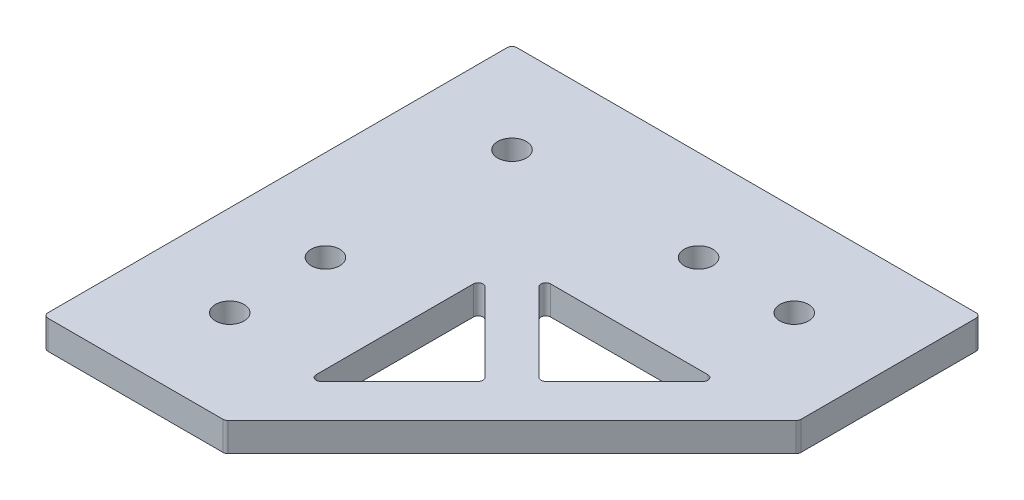
ISO-10303-21;
HEADER;
FILE_DESCRIPTION(('STEP AP214'),'2;1');
FILE_NAME('part.step','',(''),(''),'','','');
FILE_SCHEMA(('AUTOMOTIVE_DESIGN { 1 0 10303 214 1 1 1 1 }'));
ENDSEC;
DATA;
#1=APPLICATION_CONTEXT('core data for automotive mechanical design processes');
#2=APPLICATION_PROTOCOL_DEFINITION('international standard','automotive_design',2000,#1);
#3=PRODUCT_CONTEXT('',#1,'mechanical');
#4=PRODUCT('Part','Part','',(#3));
#5=PRODUCT_RELATED_PRODUCT_CATEGORY('part','',(#4));
#6=PRODUCT_DEFINITION_FORMATION('','',#4);
#7=PRODUCT_DEFINITION_CONTEXT('part definition',#1,'design');
#8=PRODUCT_DEFINITION('design','',#6,#7);
#9=PRODUCT_DEFINITION_SHAPE('','',#8);
#10=(LENGTH_UNIT() NAMED_UNIT(*) SI_UNIT(.MILLI.,.METRE.));
#11=(NAMED_UNIT(*) PLANE_ANGLE_UNIT() SI_UNIT($,.RADIAN.));
#12=(NAMED_UNIT(*) SI_UNIT($,.STERADIAN.) SOLID_ANGLE_UNIT());
#13=UNCERTAINTY_MEASURE_WITH_UNIT(LENGTH_MEASURE(1.E-05),#10,'distance_accuracy_value','');
#14=(GEOMETRIC_REPRESENTATION_CONTEXT(3) GLOBAL_UNCERTAINTY_ASSIGNED_CONTEXT((#13)) GLOBAL_UNIT_ASSIGNED_CONTEXT((#10,
#11,#12)) REPRESENTATION_CONTEXT('',''));
#15=CARTESIAN_POINT('',(0.,0.,0.));
#16=DIRECTION('',(0.,0.,1.));
#17=DIRECTION('',(1.,0.,0.));
#18=AXIS2_PLACEMENT_3D('',#15,#16,#17);
#19=CARTESIAN_POINT('',(0.,3.,0.));
#20=DIRECTION('',(0.,1.,0.));
#21=DIRECTION('',(0.,0.,1.));
#22=AXIS2_PLACEMENT_3D('',#19,#20,#21);
#23=PLANE('',#22);
#24=CARTESIAN_POINT('',(28.3431457505076,3.,31.8786796564404));
#25=DIRECTION('',(0.,1.,0.));
#26=DIRECTION('',(0.,0.,-1.));
#27=AXIS2_PLACEMENT_3D('',#24,#25,#26);
#28=CIRCLE('',#27,0.499999999999998);
#29=CARTESIAN_POINT('',(28.6966991411009,3.,32.2322330470336));
#30=VERTEX_POINT('',#29);
#31=CARTESIAN_POINT('',(28.6966991411009,3.,31.5251262658471));
#32=VERTEX_POINT('',#31);
#33=EDGE_CURVE('E48',#30,#32,#28,.T.);
#34=ORIENTED_EDGE('',*,*,#33,.F.);
#35=DIRECTION('',(0.707106781186547,0.,-0.707106781186548));
#36=VECTOR('',#35,1.);
#37=CARTESIAN_POINT('',(28.6966991411009,3.,32.2322330470336));
#38=LINE('',#37,#36);
#39=CARTESIAN_POINT('',(20.4764466094067,3.,40.4524855787278));
#40=VERTEX_POINT('',#39);
#41=EDGE_CURVE('E204',#40,#30,#38,.T.);
#42=ORIENTED_EDGE('',*,*,#41,.F.);
#43=CARTESIAN_POINT('',(20.1228932188135,3.,40.0989321881345));
#44=DIRECTION('',(0.,1.,0.));
#45=DIRECTION('',(0.,0.,-1.));
#46=AXIS2_PLACEMENT_3D('',#43,#44,#45);
#47=CIRCLE('',#46,0.500000000000001);
#48=CARTESIAN_POINT('',(19.6228932188135,3.,40.0989321881345));
#49=VERTEX_POINT('',#48);
#50=EDGE_CURVE('E207',#49,#40,#47,.T.);
#51=ORIENTED_EDGE('',*,*,#50,.F.);
#52=DIRECTION('',(0.,0.,1.));
#53=VECTOR('',#52,1.);
#54=CARTESIAN_POINT('',(19.6228932188135,3.,40.0989321881345));
#55=LINE('',#54,#53);
#56=CARTESIAN_POINT('',(19.6228932188135,3.,23.6584271247462));
#57=VERTEX_POINT('',#56);
#58=EDGE_CURVE('E223',#57,#49,#55,.T.);
#59=ORIENTED_EDGE('',*,*,#58,.F.);
#60=CARTESIAN_POINT('',(20.1228932188135,3.,23.6584271247462));
#61=DIRECTION('',(0.,1.,0.));
#62=DIRECTION('',(0.,0.,1.));
#63=AXIS2_PLACEMENT_3D('',#60,#61,#62);
#64=CIRCLE('',#63,0.499999999999999);
#65=CARTESIAN_POINT('',(20.4764466094067,3.,23.3048737341529));
#66=VERTEX_POINT('',#65);
#67=EDGE_CURVE('E220',#66,#57,#64,.T.);
#68=ORIENTED_EDGE('',*,*,#67,.F.);
#69=DIRECTION('',(-0.707106781186548,0.,-0.707106781186548));
#70=VECTOR('',#69,1.);
#71=CARTESIAN_POINT('',(20.4764466094067,3.,23.3048737341529));
#72=LINE('',#71,#70);
#73=EDGE_CURVE('E218',#32,#66,#72,.T.);
#74=ORIENTED_EDGE('',*,*,#73,.F.);
#75=EDGE_LOOP('',(#34,#42,#51,#59,#68,#74));
#76=FACE_BOUND('',#75,.T.);
#77=CARTESIAN_POINT('',(40.0989321881345,3.,20.1228932188135));
#78=DIRECTION('',(0.,1.,0.));
#79=DIRECTION('',(0.,0.,-1.));
#80=AXIS2_PLACEMENT_3D('',#77,#78,#79);
#81=CIRCLE('',#80,0.500000000000001);
#82=CARTESIAN_POINT('',(40.4524855787278,3.,20.4764466094067));
#83=VERTEX_POINT('',#82);
#84=CARTESIAN_POINT('',(40.0989321881345,3.,19.6228932188135));
#85=VERTEX_POINT('',#84);
#86=EDGE_CURVE('E56',#83,#85,#81,.T.);
#87=ORIENTED_EDGE('',*,*,#86,.F.);
#88=DIRECTION('',(0.707106781186548,0.,-0.707106781186547));
#89=VECTOR('',#88,1.);
#90=CARTESIAN_POINT('',(40.4524855787278,3.,20.4764466094067));
#91=LINE('',#90,#89);
#92=CARTESIAN_POINT('',(32.2322330470336,3.,28.6966991411009));
#93=VERTEX_POINT('',#92);
#94=EDGE_CURVE('E241',#93,#83,#91,.T.);
#95=ORIENTED_EDGE('',*,*,#94,.F.);
#96=CARTESIAN_POINT('',(31.8786796564404,3.,28.3431457505076));
#97=DIRECTION('',(0.,1.,0.));
#98=DIRECTION('',(0.,0.,-1.));
#99=AXIS2_PLACEMENT_3D('',#96,#97,#98);
#100=CIRCLE('',#99,0.500000000000003);
#101=CARTESIAN_POINT('',(31.5251262658471,3.,28.6966991411009));
#102=VERTEX_POINT('',#101);
#103=EDGE_CURVE('E267',#102,#93,#100,.T.);
#104=ORIENTED_EDGE('',*,*,#103,.F.);
#105=DIRECTION('',(0.707106781186547,0.,0.707106781186548));
#106=VECTOR('',#105,1.);
#107=CARTESIAN_POINT('',(31.5251262658471,3.,28.6966991411009));
#108=LINE('',#107,#106);
#109=CARTESIAN_POINT('',(23.3048737341529,3.,20.4764466094067));
#110=VERTEX_POINT('',#109);
#111=EDGE_CURVE('E264',#110,#102,#108,.T.);
#112=ORIENTED_EDGE('',*,*,#111,.F.);
#113=CARTESIAN_POINT('',(23.6584271247462,3.,20.1228932188135));
#114=DIRECTION('',(0.,1.,0.));
#115=DIRECTION('',(0.,0.,1.));
#116=AXIS2_PLACEMENT_3D('',#113,#114,#115);
#117=CIRCLE('',#116,0.499999999999999);
#118=CARTESIAN_POINT('',(23.6584271247462,3.,19.6228932188135));
#119=VERTEX_POINT('',#118);
#120=EDGE_CURVE('E261',#119,#110,#117,.T.);
#121=ORIENTED_EDGE('',*,*,#120,.F.);
#122=DIRECTION('',(-1.,0.,0.));
#123=VECTOR('',#122,1.);
#124=CARTESIAN_POINT('',(23.6584271247462,3.,19.6228932188135));
#125=LINE('',#124,#123);
#126=EDGE_CURVE('E258',#85,#119,#125,.T.);
#127=ORIENTED_EDGE('',*,*,#126,.F.);
#128=EDGE_LOOP('',(#87,#95,#104,#112,#121,#127));
#129=FACE_BOUND('',#128,.T.);
#130=CARTESIAN_POINT('',(9.50000000000001,3.,29.));
#131=DIRECTION('',(0.,1.,0.));
#132=DIRECTION('',(0.,0.,1.));
#133=AXIS2_PLACEMENT_3D('',#130,#131,#132);
#134=CIRCLE('',#133,1.5);
#135=CARTESIAN_POINT('',(9.50000000000001,3.,30.5));
#136=VERTEX_POINT('',#135);
#137=EDGE_CURVE('E290',#136,#136,#134,.T.);
#138=ORIENTED_EDGE('',*,*,#137,.F.);
#139=EDGE_LOOP('',(#138));
#140=FACE_BOUND('',#139,.T.);
#141=CARTESIAN_POINT('',(39.,3.,9.5));
#142=DIRECTION('',(0.,1.,0.));
#143=DIRECTION('',(0.,0.,1.));
#144=AXIS2_PLACEMENT_3D('',#141,#142,#143);
#145=CIRCLE('',#144,1.5);
#146=CARTESIAN_POINT('',(39.,3.,11.));
#147=VERTEX_POINT('',#146);
#148=EDGE_CURVE('E302',#147,#147,#145,.T.);
#149=ORIENTED_EDGE('',*,*,#148,.F.);
#150=EDGE_LOOP('',(#149));
#151=FACE_BOUND('',#150,.T.);
#152=DIRECTION('',(-1.,0.,0.));
#153=VECTOR('',#152,1.);
#154=CARTESIAN_POINT('',(0.,3.,0.));
#155=LINE('',#154,#153);
#156=CARTESIAN_POINT('',(48.5,3.,0.));
#157=VERTEX_POINT('',#156);
#158=CARTESIAN_POINT('',(0.499999999999996,3.,0.));
#159=VERTEX_POINT('',#158);
#160=EDGE_CURVE('E327',#157,#159,#155,.T.);
#161=ORIENTED_EDGE('',*,*,#160,.T.);
#162=CARTESIAN_POINT('',(0.499999999999996,3.,0.5));
#163=DIRECTION('',(0.,1.,0.));
#164=DIRECTION('',(0.,0.,1.));
#165=AXIS2_PLACEMENT_3D('',#162,#163,#164);
#166=CIRCLE('',#165,0.5);
#167=CARTESIAN_POINT('',(0.,3.,0.500000000000001));
#168=VERTEX_POINT('',#167);
#169=EDGE_CURVE('E371',#159,#168,#166,.T.);
#170=ORIENTED_EDGE('',*,*,#169,.T.);
#171=DIRECTION('',(0.,0.,1.));
#172=VECTOR('',#171,1.);
#173=CARTESIAN_POINT('',(0.,3.,0.));
#174=LINE('',#173,#172);
#175=CARTESIAN_POINT('',(0.,3.,48.5));
#176=VERTEX_POINT('',#175);
#177=EDGE_CURVE('E314',#168,#176,#174,.T.);
#178=ORIENTED_EDGE('',*,*,#177,.T.);
#179=CARTESIAN_POINT('',(0.500000000000006,3.,48.5));
#180=DIRECTION('',(0.,1.,0.));
#181=DIRECTION('',(0.,0.,1.));
#182=AXIS2_PLACEMENT_3D('',#179,#180,#181);
#183=CIRCLE('',#182,0.5);
#184=CARTESIAN_POINT('',(0.500000000000006,3.,49.));
#185=VERTEX_POINT('',#184);
#186=EDGE_CURVE('E365',#176,#185,#183,.T.);
#187=ORIENTED_EDGE('',*,*,#186,.T.);
#188=DIRECTION('',(1.,0.,0.));
#189=VECTOR('',#188,1.);
#190=CARTESIAN_POINT('',(0.,3.,49.));
#191=LINE('',#190,#189);
#192=CARTESIAN_POINT('',(18.7928932188135,3.,49.));
#193=VERTEX_POINT('',#192);
#194=EDGE_CURVE('E317',#185,#193,#191,.T.);
#195=ORIENTED_EDGE('',*,*,#194,.T.);
#196=CARTESIAN_POINT('',(18.7928932188135,3.,48.5));
#197=DIRECTION('',(0.,1.,0.));
#198=DIRECTION('',(0.,0.,1.));
#199=AXIS2_PLACEMENT_3D('',#196,#197,#198);
#200=CIRCLE('',#199,0.5);
#201=CARTESIAN_POINT('',(19.1464466094067,3.,48.8535533905933));
#202=VERTEX_POINT('',#201);
#203=EDGE_CURVE('E363',#193,#202,#200,.T.);
#204=ORIENTED_EDGE('',*,*,#203,.T.);
#205=DIRECTION('',(0.707106781186547,0.,-0.707106781186547));
#206=VECTOR('',#205,1.);
#207=CARTESIAN_POINT('',(49.,3.,19.));
#208=LINE('',#207,#206);
#209=CARTESIAN_POINT('',(48.8535533905933,3.,19.1464466094067));
#210=VERTEX_POINT('',#209);
#211=EDGE_CURVE('E321',#202,#210,#208,.T.);
#212=ORIENTED_EDGE('',*,*,#211,.T.);
#213=CARTESIAN_POINT('',(48.5,3.,18.7928932188135));
#214=DIRECTION('',(0.,1.,0.));
#215=DIRECTION('',(0.,0.,1.));
#216=AXIS2_PLACEMENT_3D('',#213,#214,#215);
#217=CIRCLE('',#216,0.5);
#218=CARTESIAN_POINT('',(49.,3.,18.7928932188135));
#219=VERTEX_POINT('',#218);
#220=EDGE_CURVE('E367',#210,#219,#217,.T.);
#221=ORIENTED_EDGE('',*,*,#220,.T.);
#222=DIRECTION('',(0.,0.,-1.));
#223=VECTOR('',#222,1.);
#224=CARTESIAN_POINT('',(49.,3.,0.));
#225=LINE('',#224,#223);
#226=CARTESIAN_POINT('',(49.,3.,0.5));
#227=VERTEX_POINT('',#226);
#228=EDGE_CURVE('E324',#219,#227,#225,.T.);
#229=ORIENTED_EDGE('',*,*,#228,.T.);
#230=CARTESIAN_POINT('',(48.5,3.,0.5));
#231=DIRECTION('',(0.,1.,0.));
#232=DIRECTION('',(0.,0.,1.));
#233=AXIS2_PLACEMENT_3D('',#230,#231,#232);
#234=CIRCLE('',#233,0.5);
#235=EDGE_CURVE('E369',#227,#157,#234,.T.);
#236=ORIENTED_EDGE('',*,*,#235,.T.);
#237=EDGE_LOOP('',(#161,#170,#178,#187,#195,#204,#212,#221,#229,#236));
#238=FACE_BOUND('',#237,.T.);
#239=CARTESIAN_POINT('',(9.50000000000001,3.,9.5));
#240=DIRECTION('',(0.,1.,0.));
#241=DIRECTION('',(0.,0.,1.));
#242=AXIS2_PLACEMENT_3D('',#239,#240,#241);
#243=CIRCLE('',#242,1.5);
#244=CARTESIAN_POINT('',(9.50000000000001,3.,11.));
#245=VERTEX_POINT('',#244);
#246=EDGE_CURVE('E308',#245,#245,#243,.T.);
#247=ORIENTED_EDGE('',*,*,#246,.F.);
#248=EDGE_LOOP('',(#247));
#249=FACE_BOUND('',#248,.T.);
#250=CARTESIAN_POINT('',(9.50000000000001,3.,39.));
#251=DIRECTION('',(0.,1.,0.));
#252=DIRECTION('',(0.,0.,1.));
#253=AXIS2_PLACEMENT_3D('',#250,#251,#252);
#254=CIRCLE('',#253,1.5);
#255=CARTESIAN_POINT('',(9.50000000000001,3.,40.5));
#256=VERTEX_POINT('',#255);
#257=EDGE_CURVE('E296',#256,#256,#254,.T.);
#258=ORIENTED_EDGE('',*,*,#257,.F.);
#259=EDGE_LOOP('',(#258));
#260=FACE_BOUND('',#259,.T.);
#261=CARTESIAN_POINT('',(29.,3.,9.5));
#262=DIRECTION('',(0.,1.,0.));
#263=DIRECTION('',(0.,0.,1.));
#264=AXIS2_PLACEMENT_3D('',#261,#262,#263);
#265=CIRCLE('',#264,1.5);
#266=CARTESIAN_POINT('',(29.,3.,11.));
#267=VERTEX_POINT('',#266);
#268=EDGE_CURVE('E284',#267,#267,#265,.T.);
#269=ORIENTED_EDGE('',*,*,#268,.F.);
#270=EDGE_LOOP('',(#269));
#271=FACE_BOUND('',#270,.T.);
#272=ADVANCED_FACE('F33',(#76,#129,#140,#151,#238,#249,#260,#271),#23,.T.);
#273=CARTESIAN_POINT('',(0.,0.,0.));
#274=DIRECTION('',(0.,1.,0.));
#275=DIRECTION('',(0.,0.,1.));
#276=AXIS2_PLACEMENT_3D('',#273,#274,#275);
#277=PLANE('',#276);
#278=DIRECTION('',(0.707106781186547,0.,-0.707106781186548));
#279=VECTOR('',#278,1.);
#280=CARTESIAN_POINT('',(28.6966991411009,0.,32.2322330470336));
#281=LINE('',#280,#279);
#282=CARTESIAN_POINT('',(20.4764466094067,0.,40.4524855787278));
#283=VERTEX_POINT('',#282);
#284=CARTESIAN_POINT('',(28.6966991411009,0.,32.2322330470336));
#285=VERTEX_POINT('',#284);
#286=EDGE_CURVE('E190',#283,#285,#281,.T.);
#287=ORIENTED_EDGE('',*,*,#286,.T.);
#288=CARTESIAN_POINT('',(28.3431457505076,0.,31.8786796564404));
#289=DIRECTION('',(0.,1.,0.));
#290=DIRECTION('',(0.,0.,-1.));
#291=AXIS2_PLACEMENT_3D('',#288,#289,#290);
#292=CIRCLE('',#291,0.499999999999998);
#293=CARTESIAN_POINT('',(28.6966991411009,0.,31.5251262658471));
#294=VERTEX_POINT('',#293);
#295=EDGE_CURVE('E184',#285,#294,#292,.T.);
#296=ORIENTED_EDGE('',*,*,#295,.T.);
#297=DIRECTION('',(-0.707106781186548,0.,-0.707106781186548));
#298=VECTOR('',#297,1.);
#299=CARTESIAN_POINT('',(20.4764466094067,0.,23.3048737341529));
#300=LINE('',#299,#298);
#301=CARTESIAN_POINT('',(20.4764466094067,0.,23.3048737341529));
#302=VERTEX_POINT('',#301);
#303=EDGE_CURVE('E194',#294,#302,#300,.T.);
#304=ORIENTED_EDGE('',*,*,#303,.T.);
#305=CARTESIAN_POINT('',(20.1228932188135,0.,23.6584271247462));
#306=DIRECTION('',(0.,1.,0.));
#307=DIRECTION('',(0.,0.,1.));
#308=AXIS2_PLACEMENT_3D('',#305,#306,#307);
#309=CIRCLE('',#308,0.499999999999999);
#310=CARTESIAN_POINT('',(19.6228932188135,0.,23.6584271247462));
#311=VERTEX_POINT('',#310);
#312=EDGE_CURVE('E198',#302,#311,#309,.T.);
#313=ORIENTED_EDGE('',*,*,#312,.T.);
#314=DIRECTION('',(0.,0.,1.));
#315=VECTOR('',#314,1.);
#316=CARTESIAN_POINT('',(19.6228932188135,0.,40.0989321881345));
#317=LINE('',#316,#315);
#318=CARTESIAN_POINT('',(19.6228932188135,0.,40.0989321881345));
#319=VERTEX_POINT('',#318);
#320=EDGE_CURVE('E211',#311,#319,#317,.T.);
#321=ORIENTED_EDGE('',*,*,#320,.T.);
#322=CARTESIAN_POINT('',(20.1228932188135,0.,40.0989321881345));
#323=DIRECTION('',(0.,1.,0.));
#324=DIRECTION('',(0.,0.,-1.));
#325=AXIS2_PLACEMENT_3D('',#322,#323,#324);
#326=CIRCLE('',#325,0.500000000000001);
#327=EDGE_CURVE('E214',#319,#283,#326,.T.);
#328=ORIENTED_EDGE('',*,*,#327,.T.);
#329=EDGE_LOOP('',(#287,#296,#304,#313,#321,#328));
#330=FACE_BOUND('',#329,.T.);
#331=DIRECTION('',(0.707106781186548,0.,-0.707106781186547));
#332=VECTOR('',#331,1.);
#333=CARTESIAN_POINT('',(40.4524855787278,0.,20.4764466094067));
#334=LINE('',#333,#332);
#335=CARTESIAN_POINT('',(32.2322330470336,0.,28.6966991411009));
#336=VERTEX_POINT('',#335);
#337=CARTESIAN_POINT('',(40.4524855787278,0.,20.4764466094067));
#338=VERTEX_POINT('',#337);
#339=EDGE_CURVE('E253',#336,#338,#334,.T.);
#340=ORIENTED_EDGE('',*,*,#339,.T.);
#341=CARTESIAN_POINT('',(40.0989321881345,0.,20.1228932188135));
#342=DIRECTION('',(0.,1.,0.));
#343=DIRECTION('',(0.,0.,-1.));
#344=AXIS2_PLACEMENT_3D('',#341,#342,#343);
#345=CIRCLE('',#344,0.500000000000001);
#346=CARTESIAN_POINT('',(40.0989321881345,0.,19.6228932188135));
#347=VERTEX_POINT('',#346);
#348=EDGE_CURVE('E237',#338,#347,#345,.T.);
#349=ORIENTED_EDGE('',*,*,#348,.T.);
#350=DIRECTION('',(-1.,0.,0.));
#351=VECTOR('',#350,1.);
#352=CARTESIAN_POINT('',(23.6584271247462,0.,19.6228932188135));
#353=LINE('',#352,#351);
#354=CARTESIAN_POINT('',(23.6584271247462,0.,19.6228932188135));
#355=VERTEX_POINT('',#354);
#356=EDGE_CURVE('E240',#347,#355,#353,.T.);
#357=ORIENTED_EDGE('',*,*,#356,.T.);
#358=CARTESIAN_POINT('',(23.6584271247462,0.,20.1228932188135));
#359=DIRECTION('',(0.,1.,0.));
#360=DIRECTION('',(0.,0.,1.));
#361=AXIS2_PLACEMENT_3D('',#358,#359,#360);
#362=CIRCLE('',#361,0.499999999999999);
#363=CARTESIAN_POINT('',(23.3048737341529,0.,20.4764466094067));
#364=VERTEX_POINT('',#363);
#365=EDGE_CURVE('E244',#355,#364,#362,.T.);
#366=ORIENTED_EDGE('',*,*,#365,.T.);
#367=DIRECTION('',(0.707106781186547,0.,0.707106781186548));
#368=VECTOR('',#367,1.);
#369=CARTESIAN_POINT('',(31.5251262658471,0.,28.6966991411009));
#370=LINE('',#369,#368);
#371=CARTESIAN_POINT('',(31.5251262658471,0.,28.6966991411009));
#372=VERTEX_POINT('',#371);
#373=EDGE_CURVE('E247',#364,#372,#370,.T.);
#374=ORIENTED_EDGE('',*,*,#373,.T.);
#375=CARTESIAN_POINT('',(31.8786796564404,0.,28.3431457505076));
#376=DIRECTION('',(0.,1.,0.));
#377=DIRECTION('',(0.,0.,-1.));
#378=AXIS2_PLACEMENT_3D('',#375,#376,#377);
#379=CIRCLE('',#378,0.500000000000003);
#380=EDGE_CURVE('E250',#372,#336,#379,.T.);
#381=ORIENTED_EDGE('',*,*,#380,.T.);
#382=EDGE_LOOP('',(#340,#349,#357,#366,#374,#381));
#383=FACE_BOUND('',#382,.T.);
#384=DIRECTION('',(0.,0.,1.));
#385=VECTOR('',#384,1.);
#386=CARTESIAN_POINT('',(0.,0.,19.));
#387=LINE('',#386,#385);
#388=CARTESIAN_POINT('',(0.,0.,0.5));
#389=VERTEX_POINT('',#388);
#390=CARTESIAN_POINT('',(0.,0.,48.5));
#391=VERTEX_POINT('',#390);
#392=EDGE_CURVE('E311',#389,#391,#387,.T.);
#393=ORIENTED_EDGE('',*,*,#392,.F.);
#394=CARTESIAN_POINT('',(0.499999999999996,0.,0.5));
#395=DIRECTION('',(0.,1.,0.));
#396=DIRECTION('',(0.,0.,1.));
#397=AXIS2_PLACEMENT_3D('',#394,#395,#396);
#398=CIRCLE('',#397,0.5);
#399=CARTESIAN_POINT('',(0.499999999999996,0.,0.));
#400=VERTEX_POINT('',#399);
#401=EDGE_CURVE('E356',#389,#400,#398,.F.);
#402=ORIENTED_EDGE('',*,*,#401,.T.);
#403=DIRECTION('',(-1.,0.,0.));
#404=VECTOR('',#403,1.);
#405=CARTESIAN_POINT('',(0.,0.,0.));
#406=LINE('',#405,#404);
#407=CARTESIAN_POINT('',(48.5,0.,0.));
#408=VERTEX_POINT('',#407);
#409=EDGE_CURVE('E318',#408,#400,#406,.T.);
#410=ORIENTED_EDGE('',*,*,#409,.F.);
#411=CARTESIAN_POINT('',(48.5,0.,0.5));
#412=DIRECTION('',(0.,1.,0.));
#413=DIRECTION('',(0.,0.,1.));
#414=AXIS2_PLACEMENT_3D('',#411,#412,#413);
#415=CIRCLE('',#414,0.5);
#416=CARTESIAN_POINT('',(49.,0.,0.5));
#417=VERTEX_POINT('',#416);
#418=EDGE_CURVE('E354',#408,#417,#415,.F.);
#419=ORIENTED_EDGE('',*,*,#418,.T.);
#420=DIRECTION('',(0.,0.,-1.));
#421=VECTOR('',#420,1.);
#422=CARTESIAN_POINT('',(49.,0.,0.));
#423=LINE('',#422,#421);
#424=CARTESIAN_POINT('',(49.,0.,18.7928932188135));
#425=VERTEX_POINT('',#424);
#426=EDGE_CURVE('E339',#425,#417,#423,.T.);
#427=ORIENTED_EDGE('',*,*,#426,.F.);
#428=CARTESIAN_POINT('',(48.5,0.,18.7928932188135));
#429=DIRECTION('',(0.,1.,0.));
#430=DIRECTION('',(0.,0.,1.));
#431=AXIS2_PLACEMENT_3D('',#428,#429,#430);
#432=CIRCLE('',#431,0.5);
#433=CARTESIAN_POINT('',(48.8535533905933,0.,19.1464466094067));
#434=VERTEX_POINT('',#433);
#435=EDGE_CURVE('E352',#425,#434,#432,.F.);
#436=ORIENTED_EDGE('',*,*,#435,.T.);
#437=DIRECTION('',(0.707106781186547,0.,-0.707106781186547));
#438=VECTOR('',#437,1.);
#439=CARTESIAN_POINT('',(49.,0.,19.));
#440=LINE('',#439,#438);
#441=CARTESIAN_POINT('',(19.1464466094067,0.,48.8535533905933));
#442=VERTEX_POINT('',#441);
#443=EDGE_CURVE('E336',#442,#434,#440,.T.);
#444=ORIENTED_EDGE('',*,*,#443,.F.);
#445=CARTESIAN_POINT('',(18.7928932188135,0.,48.5));
#446=DIRECTION('',(0.,1.,0.));
#447=DIRECTION('',(0.,0.,1.));
#448=AXIS2_PLACEMENT_3D('',#445,#446,#447);
#449=CIRCLE('',#448,0.5);
#450=CARTESIAN_POINT('',(18.7928932188135,0.,49.));
#451=VERTEX_POINT('',#450);
#452=EDGE_CURVE('E348',#442,#451,#449,.F.);
#453=ORIENTED_EDGE('',*,*,#452,.T.);
#454=DIRECTION('',(1.,0.,0.));
#455=VECTOR('',#454,1.);
#456=CARTESIAN_POINT('',(0.,0.,49.));
#457=LINE('',#456,#455);
#458=CARTESIAN_POINT('',(0.500000000000006,0.,49.));
#459=VERTEX_POINT('',#458);
#460=EDGE_CURVE('E333',#459,#451,#457,.T.);
#461=ORIENTED_EDGE('',*,*,#460,.F.);
#462=CARTESIAN_POINT('',(0.500000000000006,0.,48.5));
#463=DIRECTION('',(0.,1.,0.));
#464=DIRECTION('',(0.,0.,1.));
#465=AXIS2_PLACEMENT_3D('',#462,#463,#464);
#466=CIRCLE('',#465,0.5);
#467=EDGE_CURVE('E350',#459,#391,#466,.F.);
#468=ORIENTED_EDGE('',*,*,#467,.T.);
#469=EDGE_LOOP('',(#393,#402,#410,#419,#427,#436,#444,#453,#461,#468));
#470=FACE_BOUND('',#469,.T.);
#471=CARTESIAN_POINT('',(9.50000000000001,0.,9.5));
#472=DIRECTION('',(0.,1.,0.));
#473=DIRECTION('',(0.,0.,1.));
#474=AXIS2_PLACEMENT_3D('',#471,#472,#473);
#475=CIRCLE('',#474,1.5);
#476=CARTESIAN_POINT('',(9.50000000000001,0.,11.));
#477=VERTEX_POINT('',#476);
#478=EDGE_CURVE('E305',#477,#477,#475,.T.);
#479=ORIENTED_EDGE('',*,*,#478,.T.);
#480=EDGE_LOOP('',(#479));
#481=FACE_BOUND('',#480,.T.);
#482=CARTESIAN_POINT('',(39.,0.,9.5));
#483=DIRECTION('',(0.,1.,0.));
#484=DIRECTION('',(0.,0.,1.));
#485=AXIS2_PLACEMENT_3D('',#482,#483,#484);
#486=CIRCLE('',#485,1.5);
#487=CARTESIAN_POINT('',(39.,0.,11.));
#488=VERTEX_POINT('',#487);
#489=EDGE_CURVE('E299',#488,#488,#486,.T.);
#490=ORIENTED_EDGE('',*,*,#489,.T.);
#491=EDGE_LOOP('',(#490));
#492=FACE_BOUND('',#491,.T.);
#493=CARTESIAN_POINT('',(9.50000000000001,0.,39.));
#494=DIRECTION('',(0.,1.,0.));
#495=DIRECTION('',(0.,0.,1.));
#496=AXIS2_PLACEMENT_3D('',#493,#494,#495);
#497=CIRCLE('',#496,1.5);
#498=CARTESIAN_POINT('',(9.50000000000001,0.,40.5));
#499=VERTEX_POINT('',#498);
#500=EDGE_CURVE('E293',#499,#499,#497,.T.);
#501=ORIENTED_EDGE('',*,*,#500,.T.);
#502=EDGE_LOOP('',(#501));
#503=FACE_BOUND('',#502,.T.);
#504=CARTESIAN_POINT('',(9.50000000000001,0.,29.));
#505=DIRECTION('',(0.,1.,0.));
#506=DIRECTION('',(0.,0.,1.));
#507=AXIS2_PLACEMENT_3D('',#504,#505,#506);
#508=CIRCLE('',#507,1.5);
#509=CARTESIAN_POINT('',(9.50000000000001,0.,30.5));
#510=VERTEX_POINT('',#509);
#511=EDGE_CURVE('E287',#510,#510,#508,.T.);
#512=ORIENTED_EDGE('',*,*,#511,.T.);
#513=EDGE_LOOP('',(#512));
#514=FACE_BOUND('',#513,.T.);
#515=CARTESIAN_POINT('',(29.,0.,9.5));
#516=DIRECTION('',(0.,1.,0.));
#517=DIRECTION('',(0.,0.,1.));
#518=AXIS2_PLACEMENT_3D('',#515,#516,#517);
#519=CIRCLE('',#518,1.5);
#520=CARTESIAN_POINT('',(29.,0.,11.));
#521=VERTEX_POINT('',#520);
#522=EDGE_CURVE('E274',#521,#521,#519,.T.);
#523=ORIENTED_EDGE('',*,*,#522,.T.);
#524=EDGE_LOOP('',(#523));
#525=FACE_BOUND('',#524,.T.);
#526=ADVANCED_FACE('F200',(#330,#383,#470,#481,#492,#503,#514,#525),#277,.F.);
#527=CARTESIAN_POINT('',(0.,3.,19.));
#528=DIRECTION('',(1.,0.,0.));
#529=DIRECTION('',(0.,0.,-1.));
#530=AXIS2_PLACEMENT_3D('',#527,#528,#529);
#531=PLANE('',#530);
#532=ORIENTED_EDGE('',*,*,#177,.F.);
#533=DIRECTION('',(0.,-1.,0.));
#534=VECTOR('',#533,1.);
#535=CARTESIAN_POINT('',(0.,3.,0.5));
#536=LINE('',#535,#534);
#537=EDGE_CURVE('E345',#168,#389,#536,.T.);
#538=ORIENTED_EDGE('',*,*,#537,.T.);
#539=ORIENTED_EDGE('',*,*,#392,.T.);
#540=DIRECTION('',(0.,-1.,0.));
#541=VECTOR('',#540,1.);
#542=CARTESIAN_POINT('',(0.,3.,48.5));
#543=LINE('',#542,#541);
#544=EDGE_CURVE('E330',#391,#176,#543,.F.);
#545=ORIENTED_EDGE('',*,*,#544,.T.);
#546=EDGE_LOOP('',(#532,#538,#539,#545));
#547=FACE_BOUND('',#546,.T.);
#548=ADVANCED_FACE('F426',(#547),#531,.F.);
#549=CARTESIAN_POINT('',(0.,3.,49.));
#550=DIRECTION('',(0.,0.,-1.));
#551=DIRECTION('',(-1.,0.,0.));
#552=AXIS2_PLACEMENT_3D('',#549,#550,#551);
#553=PLANE('',#552);
#554=ORIENTED_EDGE('',*,*,#194,.F.);
#555=DIRECTION('',(0.,-1.,0.));
#556=VECTOR('',#555,1.);
#557=CARTESIAN_POINT('',(0.500000000000006,3.,49.));
#558=LINE('',#557,#556);
#559=EDGE_CURVE('E11',#185,#459,#558,.T.);
#560=ORIENTED_EDGE('',*,*,#559,.T.);
#561=ORIENTED_EDGE('',*,*,#460,.T.);
#562=DIRECTION('',(0.,-1.,0.));
#563=VECTOR('',#562,1.);
#564=CARTESIAN_POINT('',(18.7928932188135,3.,49.));
#565=LINE('',#564,#563);
#566=EDGE_CURVE('E41',#451,#193,#565,.F.);
#567=ORIENTED_EDGE('',*,*,#566,.T.);
#568=EDGE_LOOP('',(#554,#560,#561,#567));
#569=FACE_BOUND('',#568,.T.);
#570=ADVANCED_FACE('F385',(#569),#553,.F.);
#571=CARTESIAN_POINT('',(49.,3.,19.));
#572=DIRECTION('',(-0.707106781186548,0.,-0.707106781186547));
#573=DIRECTION('',(-0.707106781186547,0.,0.707106781186548));
#574=AXIS2_PLACEMENT_3D('',#571,#572,#573);
#575=PLANE('',#574);
#576=ORIENTED_EDGE('',*,*,#443,.T.);
#577=DIRECTION('',(0.,-1.,0.));
#578=VECTOR('',#577,1.);
#579=CARTESIAN_POINT('',(48.8535533905933,3.,19.1464466094067));
#580=LINE('',#579,#578);
#581=EDGE_CURVE('E381',#434,#210,#580,.F.);
#582=ORIENTED_EDGE('',*,*,#581,.T.);
#583=ORIENTED_EDGE('',*,*,#211,.F.);
#584=DIRECTION('',(0.,-1.,0.));
#585=VECTOR('',#584,1.);
#586=CARTESIAN_POINT('',(19.1464466094067,3.,48.8535533905933));
#587=LINE('',#586,#585);
#588=EDGE_CURVE('E378',#202,#442,#587,.T.);
#589=ORIENTED_EDGE('',*,*,#588,.T.);
#590=EDGE_LOOP('',(#576,#582,#583,#589));
#591=FACE_BOUND('',#590,.T.);
#592=ADVANCED_FACE('F397',(#591),#575,.F.);
#593=CARTESIAN_POINT('',(49.,3.,0.));
#594=DIRECTION('',(-1.,0.,0.));
#595=DIRECTION('',(0.,0.,1.));
#596=AXIS2_PLACEMENT_3D('',#593,#594,#595);
#597=PLANE('',#596);
#598=ORIENTED_EDGE('',*,*,#426,.T.);
#599=DIRECTION('',(0.,-1.,0.));
#600=VECTOR('',#599,1.);
#601=CARTESIAN_POINT('',(49.,3.,0.5));
#602=LINE('',#601,#600);
#603=EDGE_CURVE('E376',#417,#227,#602,.F.);
#604=ORIENTED_EDGE('',*,*,#603,.T.);
#605=ORIENTED_EDGE('',*,*,#228,.F.);
#606=DIRECTION('',(0.,-1.,0.));
#607=VECTOR('',#606,1.);
#608=CARTESIAN_POINT('',(49.,3.,18.7928932188135));
#609=LINE('',#608,#607);
#610=EDGE_CURVE('E373',#219,#425,#609,.T.);
#611=ORIENTED_EDGE('',*,*,#610,.T.);
#612=EDGE_LOOP('',(#598,#604,#605,#611));
#613=FACE_BOUND('',#612,.T.);
#614=ADVANCED_FACE('F409',(#613),#597,.F.);
#615=CARTESIAN_POINT('',(0.,3.,0.));
#616=DIRECTION('',(0.,0.,1.));
#617=DIRECTION('',(1.,0.,0.));
#618=AXIS2_PLACEMENT_3D('',#615,#616,#617);
#619=PLANE('',#618);
#620=ORIENTED_EDGE('',*,*,#409,.T.);
#621=DIRECTION('',(0.,-1.,0.));
#622=VECTOR('',#621,1.);
#623=CARTESIAN_POINT('',(0.499999999999996,3.,0.));
#624=LINE('',#623,#622);
#625=EDGE_CURVE('E361',#400,#159,#624,.F.);
#626=ORIENTED_EDGE('',*,*,#625,.T.);
#627=ORIENTED_EDGE('',*,*,#160,.F.);
#628=DIRECTION('',(0.,-1.,0.));
#629=VECTOR('',#628,1.);
#630=CARTESIAN_POINT('',(48.5,3.,0.));
#631=LINE('',#630,#629);
#632=EDGE_CURVE('E358',#157,#408,#631,.T.);
#633=ORIENTED_EDGE('',*,*,#632,.T.);
#634=EDGE_LOOP('',(#620,#626,#627,#633));
#635=FACE_BOUND('',#634,.T.);
#636=ADVANCED_FACE('F418',(#635),#619,.F.);
#637=CARTESIAN_POINT('',(9.50000000000001,3.,9.5));
#638=DIRECTION('',(0.,-1.,0.));
#639=DIRECTION('',(0.,0.,-1.));
#640=AXIS2_PLACEMENT_3D('',#637,#638,#639);
#641=CYLINDRICAL_SURFACE('',#640,1.5);
#642=ORIENTED_EDGE('',*,*,#246,.T.);
#643=EDGE_LOOP('',(#642));
#644=FACE_BOUND('',#643,.T.);
#645=ORIENTED_EDGE('',*,*,#478,.F.);
#646=EDGE_LOOP('',(#645));
#647=FACE_BOUND('',#646,.T.);
#648=ADVANCED_FACE('F446',(#644,#647),#641,.F.);
#649=CARTESIAN_POINT('',(39.,3.,9.5));
#650=DIRECTION('',(0.,-1.,0.));
#651=DIRECTION('',(0.,0.,-1.));
#652=AXIS2_PLACEMENT_3D('',#649,#650,#651);
#653=CYLINDRICAL_SURFACE('',#652,1.5);
#654=ORIENTED_EDGE('',*,*,#148,.T.);
#655=EDGE_LOOP('',(#654));
#656=FACE_BOUND('',#655,.T.);
#657=ORIENTED_EDGE('',*,*,#489,.F.);
#658=EDGE_LOOP('',(#657));
#659=FACE_BOUND('',#658,.T.);
#660=ADVANCED_FACE('F620',(#656,#659),#653,.F.);
#661=CARTESIAN_POINT('',(9.50000000000001,3.,39.));
#662=DIRECTION('',(0.,-1.,0.));
#663=DIRECTION('',(0.,0.,-1.));
#664=AXIS2_PLACEMENT_3D('',#661,#662,#663);
#665=CYLINDRICAL_SURFACE('',#664,1.5);
#666=ORIENTED_EDGE('',*,*,#257,.T.);
#667=EDGE_LOOP('',(#666));
#668=FACE_BOUND('',#667,.T.);
#669=ORIENTED_EDGE('',*,*,#500,.F.);
#670=EDGE_LOOP('',(#669));
#671=FACE_BOUND('',#670,.T.);
#672=ADVANCED_FACE('F617',(#668,#671),#665,.F.);
#673=CARTESIAN_POINT('',(9.50000000000001,3.,29.));
#674=DIRECTION('',(0.,-1.,0.));
#675=DIRECTION('',(0.,0.,-1.));
#676=AXIS2_PLACEMENT_3D('',#673,#674,#675);
#677=CYLINDRICAL_SURFACE('',#676,1.5);
#678=ORIENTED_EDGE('',*,*,#137,.T.);
#679=EDGE_LOOP('',(#678));
#680=FACE_BOUND('',#679,.T.);
#681=ORIENTED_EDGE('',*,*,#511,.F.);
#682=EDGE_LOOP('',(#681));
#683=FACE_BOUND('',#682,.T.);
#684=ADVANCED_FACE('F613',(#680,#683),#677,.F.);
#685=CARTESIAN_POINT('',(29.,3.,9.5));
#686=DIRECTION('',(0.,-1.,0.));
#687=DIRECTION('',(0.,0.,-1.));
#688=AXIS2_PLACEMENT_3D('',#685,#686,#687);
#689=CYLINDRICAL_SURFACE('',#688,1.5);
#690=ORIENTED_EDGE('',*,*,#268,.T.);
#691=EDGE_LOOP('',(#690));
#692=FACE_BOUND('',#691,.T.);
#693=ORIENTED_EDGE('',*,*,#522,.F.);
#694=EDGE_LOOP('',(#693));
#695=FACE_BOUND('',#694,.T.);
#696=ADVANCED_FACE('F461',(#692,#695),#689,.F.);
#697=CARTESIAN_POINT('',(0.499999999999996,3.,0.5));
#698=DIRECTION('',(0.,-1.,0.));
#699=DIRECTION('',(0.,0.,-1.));
#700=AXIS2_PLACEMENT_3D('',#697,#698,#699);
#701=CYLINDRICAL_SURFACE('',#700,0.5);
#702=ORIENTED_EDGE('',*,*,#169,.F.);
#703=ORIENTED_EDGE('',*,*,#625,.F.);
#704=ORIENTED_EDGE('',*,*,#401,.F.);
#705=ORIENTED_EDGE('',*,*,#537,.F.);
#706=EDGE_LOOP('',(#702,#703,#704,#705));
#707=FACE_BOUND('',#706,.T.);
#708=ADVANCED_FACE('F423',(#707),#701,.T.);
#709=CARTESIAN_POINT('',(48.5,3.,0.5));
#710=DIRECTION('',(0.,-1.,0.));
#711=DIRECTION('',(0.,0.,-1.));
#712=AXIS2_PLACEMENT_3D('',#709,#710,#711);
#713=CYLINDRICAL_SURFACE('',#712,0.5);
#714=ORIENTED_EDGE('',*,*,#235,.F.);
#715=ORIENTED_EDGE('',*,*,#603,.F.);
#716=ORIENTED_EDGE('',*,*,#418,.F.);
#717=ORIENTED_EDGE('',*,*,#632,.F.);
#718=EDGE_LOOP('',(#714,#715,#716,#717));
#719=FACE_BOUND('',#718,.T.);
#720=ADVANCED_FACE('F415',(#719),#713,.T.);
#721=CARTESIAN_POINT('',(48.5,3.,18.7928932188135));
#722=DIRECTION('',(0.,-1.,0.));
#723=DIRECTION('',(0.,0.,-1.));
#724=AXIS2_PLACEMENT_3D('',#721,#722,#723);
#725=CYLINDRICAL_SURFACE('',#724,0.5);
#726=ORIENTED_EDGE('',*,*,#220,.F.);
#727=ORIENTED_EDGE('',*,*,#581,.F.);
#728=ORIENTED_EDGE('',*,*,#435,.F.);
#729=ORIENTED_EDGE('',*,*,#610,.F.);
#730=EDGE_LOOP('',(#726,#727,#728,#729));
#731=FACE_BOUND('',#730,.T.);
#732=ADVANCED_FACE('F406',(#731),#725,.T.);
#733=CARTESIAN_POINT('',(0.500000000000006,3.,48.5));
#734=DIRECTION('',(0.,-1.,0.));
#735=DIRECTION('',(0.,0.,-1.));
#736=AXIS2_PLACEMENT_3D('',#733,#734,#735);
#737=CYLINDRICAL_SURFACE('',#736,0.5);
#738=ORIENTED_EDGE('',*,*,#186,.F.);
#739=ORIENTED_EDGE('',*,*,#544,.F.);
#740=ORIENTED_EDGE('',*,*,#467,.F.);
#741=ORIENTED_EDGE('',*,*,#559,.F.);
#742=EDGE_LOOP('',(#738,#739,#740,#741));
#743=FACE_BOUND('',#742,.T.);
#744=ADVANCED_FACE('F429',(#743),#737,.T.);
#745=CARTESIAN_POINT('',(18.7928932188135,3.,48.5));
#746=DIRECTION('',(0.,-1.,0.));
#747=DIRECTION('',(0.,0.,-1.));
#748=AXIS2_PLACEMENT_3D('',#745,#746,#747);
#749=CYLINDRICAL_SURFACE('',#748,0.5);
#750=ORIENTED_EDGE('',*,*,#203,.F.);
#751=ORIENTED_EDGE('',*,*,#566,.F.);
#752=ORIENTED_EDGE('',*,*,#452,.F.);
#753=ORIENTED_EDGE('',*,*,#588,.F.);
#754=EDGE_LOOP('',(#750,#751,#752,#753));
#755=FACE_BOUND('',#754,.T.);
#756=ADVANCED_FACE('F35',(#755),#749,.T.);
#757=CARTESIAN_POINT('',(40.0989321881345,0.,20.1228932188135));
#758=DIRECTION('',(0.,1.,0.));
#759=DIRECTION('',(0.,0.,1.));
#760=AXIS2_PLACEMENT_3D('',#757,#758,#759);
#761=CYLINDRICAL_SURFACE('',#760,0.500000000000001);
#762=ORIENTED_EDGE('',*,*,#86,.T.);
#763=DIRECTION('',(0.,1.,0.));
#764=VECTOR('',#763,1.);
#765=CARTESIAN_POINT('',(40.0989321881345,0.,19.6228932188135));
#766=LINE('',#765,#764);
#767=EDGE_CURVE('E256',#347,#85,#766,.T.);
#768=ORIENTED_EDGE('',*,*,#767,.F.);
#769=ORIENTED_EDGE('',*,*,#348,.F.);
#770=DIRECTION('',(0.,1.,0.));
#771=VECTOR('',#770,1.);
#772=CARTESIAN_POINT('',(40.4524855787278,0.,20.4764466094067));
#773=LINE('',#772,#771);
#774=EDGE_CURVE('E272',#338,#83,#773,.T.);
#775=ORIENTED_EDGE('',*,*,#774,.T.);
#776=EDGE_LOOP('',(#762,#768,#769,#775));
#777=FACE_BOUND('',#776,.T.);
#778=ADVANCED_FACE('F435',(#777),#761,.F.);
#779=CARTESIAN_POINT('',(40.4524855787278,0.,20.4764466094067));
#780=DIRECTION('',(0.707106781186547,0.,0.707106781186548));
#781=DIRECTION('',(0.707106781186548,0.,-0.707106781186547));
#782=AXIS2_PLACEMENT_3D('',#779,#780,#781);
#783=PLANE('',#782);
#784=ORIENTED_EDGE('',*,*,#94,.T.);
#785=ORIENTED_EDGE('',*,*,#774,.F.);
#786=ORIENTED_EDGE('',*,*,#339,.F.);
#787=DIRECTION('',(0.,1.,0.));
#788=VECTOR('',#787,1.);
#789=CARTESIAN_POINT('',(32.2322330470336,0.,28.6966991411009));
#790=LINE('',#789,#788);
#791=EDGE_CURVE('E275',#336,#93,#790,.T.);
#792=ORIENTED_EDGE('',*,*,#791,.T.);
#793=EDGE_LOOP('',(#784,#785,#786,#792));
#794=FACE_BOUND('',#793,.T.);
#795=ADVANCED_FACE('F502',(#794),#783,.F.);
#796=CARTESIAN_POINT('',(31.8786796564404,0.,28.3431457505076));
#797=DIRECTION('',(0.,1.,0.));
#798=DIRECTION('',(0.,0.,1.));
#799=AXIS2_PLACEMENT_3D('',#796,#797,#798);
#800=CYLINDRICAL_SURFACE('',#799,0.500000000000003);
#801=ORIENTED_EDGE('',*,*,#103,.T.);
#802=ORIENTED_EDGE('',*,*,#791,.F.);
#803=ORIENTED_EDGE('',*,*,#380,.F.);
#804=DIRECTION('',(0.,1.,0.));
#805=VECTOR('',#804,1.);
#806=CARTESIAN_POINT('',(31.5251262658471,0.,28.6966991411009));
#807=LINE('',#806,#805);
#808=EDGE_CURVE('E277',#372,#102,#807,.T.);
#809=ORIENTED_EDGE('',*,*,#808,.T.);
#810=EDGE_LOOP('',(#801,#802,#803,#809));
#811=FACE_BOUND('',#810,.T.);
#812=ADVANCED_FACE('F511',(#811),#800,.F.);
#813=CARTESIAN_POINT('',(31.5251262658471,0.,28.6966991411009));
#814=DIRECTION('',(-0.707106781186548,0.,0.707106781186547));
#815=DIRECTION('',(0.707106781186547,0.,0.707106781186548));
#816=AXIS2_PLACEMENT_3D('',#813,#814,#815);
#817=PLANE('',#816);
#818=ORIENTED_EDGE('',*,*,#111,.T.);
#819=ORIENTED_EDGE('',*,*,#808,.F.);
#820=ORIENTED_EDGE('',*,*,#373,.F.);
#821=DIRECTION('',(0.,1.,0.));
#822=VECTOR('',#821,1.);
#823=CARTESIAN_POINT('',(23.3048737341529,0.,20.4764466094067));
#824=LINE('',#823,#822);
#825=EDGE_CURVE('E279',#364,#110,#824,.T.);
#826=ORIENTED_EDGE('',*,*,#825,.T.);
#827=EDGE_LOOP('',(#818,#819,#820,#826));
#828=FACE_BOUND('',#827,.T.);
#829=ADVANCED_FACE('F521',(#828),#817,.F.);
#830=CARTESIAN_POINT('',(23.6584271247462,0.,20.1228932188135));
#831=DIRECTION('',(0.,1.,0.));
#832=DIRECTION('',(0.,0.,1.));
#833=AXIS2_PLACEMENT_3D('',#830,#831,#832);
#834=CYLINDRICAL_SURFACE('',#833,0.499999999999999);
#835=ORIENTED_EDGE('',*,*,#120,.T.);
#836=ORIENTED_EDGE('',*,*,#825,.F.);
#837=ORIENTED_EDGE('',*,*,#365,.F.);
#838=DIRECTION('',(0.,1.,0.));
#839=VECTOR('',#838,1.);
#840=CARTESIAN_POINT('',(23.6584271247462,0.,19.6228932188135));
#841=LINE('',#840,#839);
#842=EDGE_CURVE('E281',#355,#119,#841,.T.);
#843=ORIENTED_EDGE('',*,*,#842,.T.);
#844=EDGE_LOOP('',(#835,#836,#837,#843));
#845=FACE_BOUND('',#844,.T.);
#846=ADVANCED_FACE('F531',(#845),#834,.F.);
#847=CARTESIAN_POINT('',(23.6584271247462,0.,19.6228932188135));
#848=DIRECTION('',(0.,0.,-1.));
#849=DIRECTION('',(-1.,0.,0.));
#850=AXIS2_PLACEMENT_3D('',#847,#848,#849);
#851=PLANE('',#850);
#852=ORIENTED_EDGE('',*,*,#126,.T.);
#853=ORIENTED_EDGE('',*,*,#842,.F.);
#854=ORIENTED_EDGE('',*,*,#356,.F.);
#855=ORIENTED_EDGE('',*,*,#767,.T.);
#856=EDGE_LOOP('',(#852,#853,#854,#855));
#857=FACE_BOUND('',#856,.T.);
#858=ADVANCED_FACE('F541',(#857),#851,.F.);
#859=CARTESIAN_POINT('',(28.3431457505076,0.,31.8786796564404));
#860=DIRECTION('',(0.,1.,0.));
#861=DIRECTION('',(0.,0.,1.));
#862=AXIS2_PLACEMENT_3D('',#859,#860,#861);
#863=CYLINDRICAL_SURFACE('',#862,0.499999999999998);
#864=ORIENTED_EDGE('',*,*,#33,.T.);
#865=DIRECTION('',(0.,1.,0.));
#866=VECTOR('',#865,1.);
#867=CARTESIAN_POINT('',(28.6966991411009,0.,31.5251262658471));
#868=LINE('',#867,#866);
#869=EDGE_CURVE('E180',#294,#32,#868,.T.);
#870=ORIENTED_EDGE('',*,*,#869,.F.);
#871=ORIENTED_EDGE('',*,*,#295,.F.);
#872=DIRECTION('',(0.,1.,0.));
#873=VECTOR('',#872,1.);
#874=CARTESIAN_POINT('',(28.6966991411009,0.,32.2322330470336));
#875=LINE('',#874,#873);
#876=EDGE_CURVE('E228',#285,#30,#875,.T.);
#877=ORIENTED_EDGE('',*,*,#876,.T.);
#878=EDGE_LOOP('',(#864,#870,#871,#877));
#879=FACE_BOUND('',#878,.T.);
#880=ADVANCED_FACE('F182',(#879),#863,.F.);
#881=CARTESIAN_POINT('',(28.6966991411009,0.,32.2322330470336));
#882=DIRECTION('',(0.707106781186548,0.,0.707106781186547));
#883=DIRECTION('',(0.707106781186547,0.,-0.707106781186548));
#884=AXIS2_PLACEMENT_3D('',#881,#882,#883);
#885=PLANE('',#884);
#886=ORIENTED_EDGE('',*,*,#41,.T.);
#887=ORIENTED_EDGE('',*,*,#876,.F.);
#888=ORIENTED_EDGE('',*,*,#286,.F.);
#889=DIRECTION('',(0.,1.,0.));
#890=VECTOR('',#889,1.);
#891=CARTESIAN_POINT('',(20.4764466094067,0.,40.4524855787278));
#892=LINE('',#891,#890);
#893=EDGE_CURVE('E230',#283,#40,#892,.T.);
#894=ORIENTED_EDGE('',*,*,#893,.T.);
#895=EDGE_LOOP('',(#886,#887,#888,#894));
#896=FACE_BOUND('',#895,.T.);
#897=ADVANCED_FACE('F560',(#896),#885,.F.);
#898=CARTESIAN_POINT('',(20.1228932188135,0.,40.0989321881345));
#899=DIRECTION('',(0.,1.,0.));
#900=DIRECTION('',(0.,0.,1.));
#901=AXIS2_PLACEMENT_3D('',#898,#899,#900);
#902=CYLINDRICAL_SURFACE('',#901,0.500000000000001);
#903=ORIENTED_EDGE('',*,*,#50,.T.);
#904=ORIENTED_EDGE('',*,*,#893,.F.);
#905=ORIENTED_EDGE('',*,*,#327,.F.);
#906=DIRECTION('',(0.,1.,0.));
#907=VECTOR('',#906,1.);
#908=CARTESIAN_POINT('',(19.6228932188135,0.,40.0989321881345));
#909=LINE('',#908,#907);
#910=EDGE_CURVE('E232',#319,#49,#909,.T.);
#911=ORIENTED_EDGE('',*,*,#910,.T.);
#912=EDGE_LOOP('',(#903,#904,#905,#911));
#913=FACE_BOUND('',#912,.T.);
#914=ADVANCED_FACE('F569',(#913),#902,.F.);
#915=CARTESIAN_POINT('',(19.6228932188135,0.,40.0989321881345));
#916=DIRECTION('',(-1.,0.,0.));
#917=DIRECTION('',(0.,0.,1.));
#918=AXIS2_PLACEMENT_3D('',#915,#916,#917);
#919=PLANE('',#918);
#920=ORIENTED_EDGE('',*,*,#58,.T.);
#921=ORIENTED_EDGE('',*,*,#910,.F.);
#922=ORIENTED_EDGE('',*,*,#320,.F.);
#923=DIRECTION('',(0.,1.,0.));
#924=VECTOR('',#923,1.);
#925=CARTESIAN_POINT('',(19.6228932188135,0.,23.6584271247462));
#926=LINE('',#925,#924);
#927=EDGE_CURVE('E234',#311,#57,#926,.T.);
#928=ORIENTED_EDGE('',*,*,#927,.T.);
#929=EDGE_LOOP('',(#920,#921,#922,#928));
#930=FACE_BOUND('',#929,.T.);
#931=ADVANCED_FACE('F579',(#930),#919,.F.);
#932=CARTESIAN_POINT('',(20.1228932188135,0.,23.6584271247462));
#933=DIRECTION('',(0.,1.,0.));
#934=DIRECTION('',(0.,0.,1.));
#935=AXIS2_PLACEMENT_3D('',#932,#933,#934);
#936=CYLINDRICAL_SURFACE('',#935,0.499999999999999);
#937=ORIENTED_EDGE('',*,*,#67,.T.);
#938=ORIENTED_EDGE('',*,*,#927,.F.);
#939=ORIENTED_EDGE('',*,*,#312,.F.);
#940=DIRECTION('',(0.,1.,0.));
#941=VECTOR('',#940,1.);
#942=CARTESIAN_POINT('',(20.4764466094067,0.,23.3048737341529));
#943=LINE('',#942,#941);
#944=EDGE_CURVE('E189',#302,#66,#943,.T.);
#945=ORIENTED_EDGE('',*,*,#944,.T.);
#946=EDGE_LOOP('',(#937,#938,#939,#945));
#947=FACE_BOUND('',#946,.T.);
#948=ADVANCED_FACE('F589',(#947),#936,.F.);
#949=CARTESIAN_POINT('',(20.4764466094067,0.,23.3048737341529));
#950=DIRECTION('',(0.707106781186547,0.,-0.707106781186547));
#951=DIRECTION('',(-0.707106781186548,0.,-0.707106781186548));
#952=AXIS2_PLACEMENT_3D('',#949,#950,#951);
#953=PLANE('',#952);
#954=ORIENTED_EDGE('',*,*,#73,.T.);
#955=ORIENTED_EDGE('',*,*,#944,.F.);
#956=ORIENTED_EDGE('',*,*,#303,.F.);
#957=ORIENTED_EDGE('',*,*,#869,.T.);
#958=EDGE_LOOP('',(#954,#955,#956,#957));
#959=FACE_BOUND('',#958,.T.);
#960=ADVANCED_FACE('F195',(#959),#953,.F.);
#961=CLOSED_SHELL('',(#272,#526,#548,#570,#592,#614,#636,#648,#660,#672,#684,#696,#708,#720,
#732,#744,#756,#778,#795,#812,#829,#846,#858,#880,#897,#914,#931,#948,#960));
#962=MANIFOLD_SOLID_BREP('B2',#961);
#963=ADVANCED_BREP_SHAPE_REPRESENTATION('',(#18,#962),#14);
#964=SHAPE_DEFINITION_REPRESENTATION(#9,#963);
ENDSEC;
END-ISO-10303-21;
